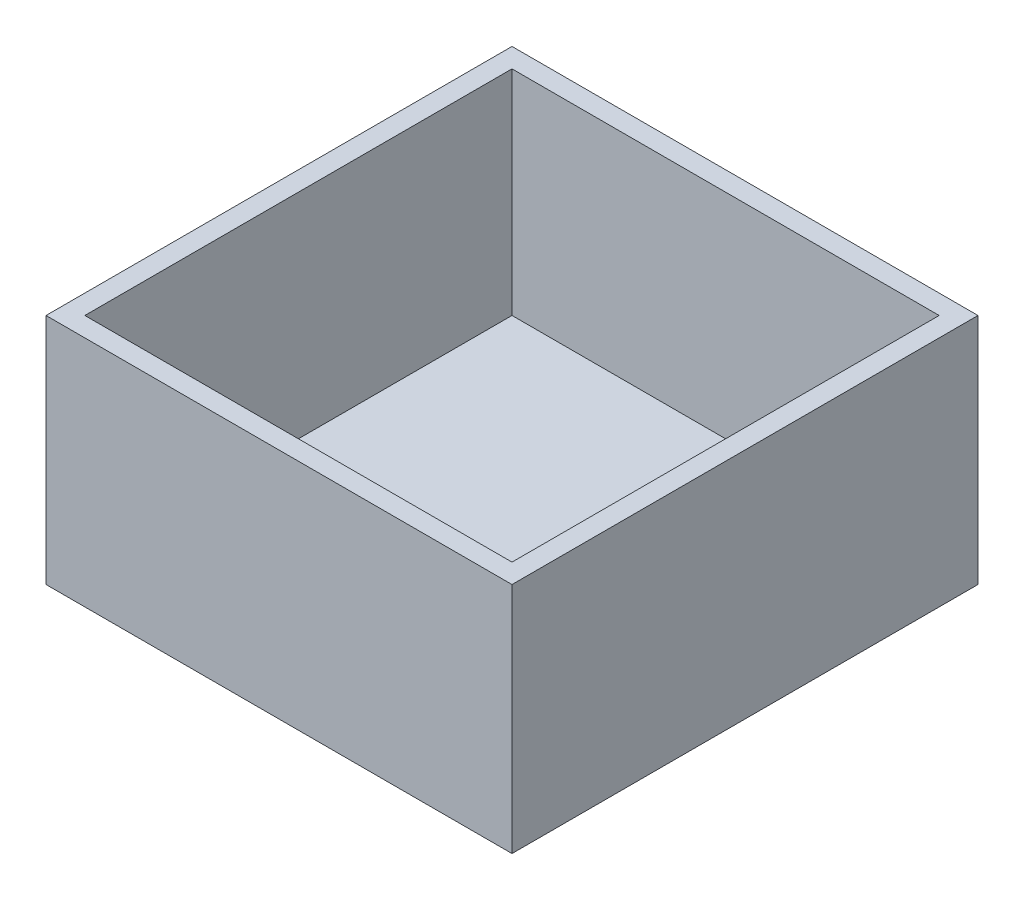
ISO-10303-21;
HEADER;
FILE_DESCRIPTION(('STEP AP214'),'2;1');
FILE_NAME('part.step','',(''),(''),'','','');
FILE_SCHEMA(('AUTOMOTIVE_DESIGN { 1 0 10303 214 1 1 1 1 }'));
ENDSEC;
DATA;
#1=APPLICATION_CONTEXT('core data for automotive mechanical design processes');
#2=APPLICATION_PROTOCOL_DEFINITION('international standard','automotive_design',2000,#1);
#3=PRODUCT_CONTEXT('',#1,'mechanical');
#4=PRODUCT('Part','Part','',(#3));
#5=PRODUCT_RELATED_PRODUCT_CATEGORY('part','',(#4));
#6=PRODUCT_DEFINITION_FORMATION('','',#4);
#7=PRODUCT_DEFINITION_CONTEXT('part definition',#1,'design');
#8=PRODUCT_DEFINITION('design','',#6,#7);
#9=PRODUCT_DEFINITION_SHAPE('','',#8);
#10=(LENGTH_UNIT() NAMED_UNIT(*) SI_UNIT(.MILLI.,.METRE.));
#11=(NAMED_UNIT(*) PLANE_ANGLE_UNIT() SI_UNIT($,.RADIAN.));
#12=(NAMED_UNIT(*) SI_UNIT($,.STERADIAN.) SOLID_ANGLE_UNIT());
#13=UNCERTAINTY_MEASURE_WITH_UNIT(LENGTH_MEASURE(1.E-05),#10,'distance_accuracy_value','');
#14=(GEOMETRIC_REPRESENTATION_CONTEXT(3) GLOBAL_UNCERTAINTY_ASSIGNED_CONTEXT((#13)) GLOBAL_UNIT_ASSIGNED_CONTEXT((#10,
#11,#12)) REPRESENTATION_CONTEXT('',''));
#15=CARTESIAN_POINT('',(0.,0.,0.));
#16=DIRECTION('',(0.,0.,1.));
#17=DIRECTION('',(1.,0.,0.));
#18=AXIS2_PLACEMENT_3D('',#15,#16,#17);
#19=CARTESIAN_POINT('',(60.,5.,60.));
#20=DIRECTION('',(-1.,0.,0.));
#21=DIRECTION('',(0.,0.,1.));
#22=AXIS2_PLACEMENT_3D('',#19,#20,#21);
#23=PLANE('',#22);
#24=DIRECTION('',(0.,0.,-1.));
#25=VECTOR('',#24,1.);
#26=CARTESIAN_POINT('',(60.,0.,60.));
#27=LINE('',#26,#25);
#28=CARTESIAN_POINT('',(60.,0.,60.));
#29=VERTEX_POINT('',#28);
#30=CARTESIAN_POINT('',(60.,0.,-60.));
#31=VERTEX_POINT('',#30);
#32=EDGE_CURVE('E154',#29,#31,#27,.T.);
#33=ORIENTED_EDGE('',*,*,#32,.T.);
#34=DIRECTION('',(0.,-1.,0.));
#35=VECTOR('',#34,1.);
#36=CARTESIAN_POINT('',(60.,5.,-60.));
#37=LINE('',#36,#35);
#38=CARTESIAN_POINT('',(60.,60.,-60.));
#39=VERTEX_POINT('',#38);
#40=EDGE_CURVE('E11',#39,#31,#37,.T.);
#41=ORIENTED_EDGE('',*,*,#40,.F.);
#42=DIRECTION('',(0.,0.,-1.));
#43=VECTOR('',#42,1.);
#44=CARTESIAN_POINT('',(60.,60.,60.));
#45=LINE('',#44,#43);
#46=CARTESIAN_POINT('',(60.,60.,60.));
#47=VERTEX_POINT('',#46);
#48=EDGE_CURVE('E119',#47,#39,#45,.T.);
#49=ORIENTED_EDGE('',*,*,#48,.F.);
#50=DIRECTION('',(0.,-1.,0.));
#51=VECTOR('',#50,1.);
#52=CARTESIAN_POINT('',(60.,5.,60.));
#53=LINE('',#52,#51);
#54=EDGE_CURVE('E162',#47,#29,#53,.T.);
#55=ORIENTED_EDGE('',*,*,#54,.T.);
#56=EDGE_LOOP('',(#33,#41,#49,#55));
#57=FACE_BOUND('',#56,.T.);
#58=ADVANCED_FACE('F37',(#57),#23,.F.);
#59=CARTESIAN_POINT('',(-60.,5.,-60.));
#60=DIRECTION('',(0.,0.,1.));
#61=DIRECTION('',(1.,0.,0.));
#62=AXIS2_PLACEMENT_3D('',#59,#60,#61);
#63=PLANE('',#62);
#64=DIRECTION('',(-1.,0.,0.));
#65=VECTOR('',#64,1.);
#66=CARTESIAN_POINT('',(-60.,0.,-60.));
#67=LINE('',#66,#65);
#68=CARTESIAN_POINT('',(-60.,0.,-60.));
#69=VERTEX_POINT('',#68);
#70=EDGE_CURVE('E157',#31,#69,#67,.T.);
#71=ORIENTED_EDGE('',*,*,#70,.T.);
#72=DIRECTION('',(0.,-1.,0.));
#73=VECTOR('',#72,1.);
#74=CARTESIAN_POINT('',(-60.,5.,-60.));
#75=LINE('',#74,#73);
#76=CARTESIAN_POINT('',(-60.,60.,-60.));
#77=VERTEX_POINT('',#76);
#78=EDGE_CURVE('E44',#77,#69,#75,.T.);
#79=ORIENTED_EDGE('',*,*,#78,.F.);
#80=DIRECTION('',(-1.,0.,0.));
#81=VECTOR('',#80,1.);
#82=CARTESIAN_POINT('',(-60.,60.,-60.));
#83=LINE('',#82,#81);
#84=EDGE_CURVE('E145',#39,#77,#83,.T.);
#85=ORIENTED_EDGE('',*,*,#84,.F.);
#86=ORIENTED_EDGE('',*,*,#40,.T.);
#87=EDGE_LOOP('',(#71,#79,#85,#86));
#88=FACE_BOUND('',#87,.T.);
#89=ADVANCED_FACE('F180',(#88),#63,.F.);
#90=CARTESIAN_POINT('',(-60.,5.,60.));
#91=DIRECTION('',(1.,0.,0.));
#92=DIRECTION('',(0.,0.,-1.));
#93=AXIS2_PLACEMENT_3D('',#90,#91,#92);
#94=PLANE('',#93);
#95=DIRECTION('',(0.,0.,1.));
#96=VECTOR('',#95,1.);
#97=CARTESIAN_POINT('',(-60.,0.,60.));
#98=LINE('',#97,#96);
#99=CARTESIAN_POINT('',(-60.,0.,60.));
#100=VERTEX_POINT('',#99);
#101=EDGE_CURVE('E159',#69,#100,#98,.T.);
#102=ORIENTED_EDGE('',*,*,#101,.T.);
#103=DIRECTION('',(0.,-1.,0.));
#104=VECTOR('',#103,1.);
#105=CARTESIAN_POINT('',(-60.,5.,60.));
#106=LINE('',#105,#104);
#107=CARTESIAN_POINT('',(-60.,60.,60.));
#108=VERTEX_POINT('',#107);
#109=EDGE_CURVE('E164',#108,#100,#106,.T.);
#110=ORIENTED_EDGE('',*,*,#109,.F.);
#111=DIRECTION('',(0.,0.,1.));
#112=VECTOR('',#111,1.);
#113=CARTESIAN_POINT('',(-60.,60.,60.));
#114=LINE('',#113,#112);
#115=EDGE_CURVE('E148',#77,#108,#114,.T.);
#116=ORIENTED_EDGE('',*,*,#115,.F.);
#117=ORIENTED_EDGE('',*,*,#78,.T.);
#118=EDGE_LOOP('',(#102,#110,#116,#117));
#119=FACE_BOUND('',#118,.T.);
#120=ADVANCED_FACE('F169',(#119),#94,.F.);
#121=CARTESIAN_POINT('',(-60.,5.,60.));
#122=DIRECTION('',(0.,0.,-1.));
#123=DIRECTION('',(-1.,0.,0.));
#124=AXIS2_PLACEMENT_3D('',#121,#122,#123);
#125=PLANE('',#124);
#126=DIRECTION('',(1.,0.,0.));
#127=VECTOR('',#126,1.);
#128=CARTESIAN_POINT('',(-60.,0.,60.));
#129=LINE('',#128,#127);
#130=EDGE_CURVE('E59',#100,#29,#129,.T.);
#131=ORIENTED_EDGE('',*,*,#130,.T.);
#132=ORIENTED_EDGE('',*,*,#54,.F.);
#133=DIRECTION('',(1.,0.,0.));
#134=VECTOR('',#133,1.);
#135=CARTESIAN_POINT('',(-60.,60.,60.));
#136=LINE('',#135,#134);
#137=EDGE_CURVE('E151',#108,#47,#136,.T.);
#138=ORIENTED_EDGE('',*,*,#137,.F.);
#139=ORIENTED_EDGE('',*,*,#109,.T.);
#140=EDGE_LOOP('',(#131,#132,#138,#139));
#141=FACE_BOUND('',#140,.T.);
#142=ADVANCED_FACE('F178',(#141),#125,.F.);
#143=CARTESIAN_POINT('',(0.,0.,0.));
#144=DIRECTION('',(0.,-1.,0.));
#145=DIRECTION('',(0.,0.,-1.));
#146=AXIS2_PLACEMENT_3D('',#143,#144,#145);
#147=PLANE('',#146);
#148=ORIENTED_EDGE('',*,*,#32,.F.);
#149=ORIENTED_EDGE('',*,*,#130,.F.);
#150=ORIENTED_EDGE('',*,*,#101,.F.);
#151=ORIENTED_EDGE('',*,*,#70,.F.);
#152=EDGE_LOOP('',(#148,#149,#150,#151));
#153=FACE_BOUND('',#152,.T.);
#154=ADVANCED_FACE('F174',(#153),#147,.T.);
#155=CARTESIAN_POINT('',(0.,60.,0.));
#156=DIRECTION('',(0.,-1.,0.));
#157=DIRECTION('',(0.,0.,-1.));
#158=AXIS2_PLACEMENT_3D('',#155,#156,#157);
#159=PLANE('',#158);
#160=ORIENTED_EDGE('',*,*,#48,.T.);
#161=ORIENTED_EDGE('',*,*,#84,.T.);
#162=ORIENTED_EDGE('',*,*,#115,.T.);
#163=ORIENTED_EDGE('',*,*,#137,.T.);
#164=EDGE_LOOP('',(#160,#161,#162,#163));
#165=FACE_BOUND('',#164,.T.);
#166=DIRECTION('',(0.,0.,-1.));
#167=VECTOR('',#166,1.);
#168=CARTESIAN_POINT('',(55.,60.,55.));
#169=LINE('',#168,#167);
#170=CARTESIAN_POINT('',(55.,60.,55.));
#171=VERTEX_POINT('',#170);
#172=CARTESIAN_POINT('',(55.,60.,-55.));
#173=VERTEX_POINT('',#172);
#174=EDGE_CURVE('E103',#171,#173,#169,.T.);
#175=ORIENTED_EDGE('',*,*,#174,.F.);
#176=DIRECTION('',(1.,0.,0.));
#177=VECTOR('',#176,1.);
#178=CARTESIAN_POINT('',(-55.,60.,55.));
#179=LINE('',#178,#177);
#180=CARTESIAN_POINT('',(-55.,60.,55.));
#181=VERTEX_POINT('',#180);
#182=EDGE_CURVE('E127',#181,#171,#179,.T.);
#183=ORIENTED_EDGE('',*,*,#182,.F.);
#184=DIRECTION('',(0.,0.,1.));
#185=VECTOR('',#184,1.);
#186=CARTESIAN_POINT('',(-55.,60.,55.));
#187=LINE('',#186,#185);
#188=CARTESIAN_POINT('',(-55.,60.,-55.));
#189=VERTEX_POINT('',#188);
#190=EDGE_CURVE('E125',#189,#181,#187,.T.);
#191=ORIENTED_EDGE('',*,*,#190,.F.);
#192=DIRECTION('',(-1.,0.,0.));
#193=VECTOR('',#192,1.);
#194=CARTESIAN_POINT('',(-55.,60.,-55.));
#195=LINE('',#194,#193);
#196=EDGE_CURVE('E111',#173,#189,#195,.T.);
#197=ORIENTED_EDGE('',*,*,#196,.F.);
#198=EDGE_LOOP('',(#175,#183,#191,#197));
#199=FACE_BOUND('',#198,.T.);
#200=ADVANCED_FACE('F123',(#165,#199),#159,.F.);
#201=CARTESIAN_POINT('',(55.,60.,55.));
#202=DIRECTION('',(-1.,0.,0.));
#203=DIRECTION('',(0.,0.,1.));
#204=AXIS2_PLACEMENT_3D('',#201,#202,#203);
#205=PLANE('',#204);
#206=DIRECTION('',(0.,0.,-1.));
#207=VECTOR('',#206,1.);
#208=CARTESIAN_POINT('',(55.,5.,55.));
#209=LINE('',#208,#207);
#210=CARTESIAN_POINT('',(55.,5.,55.));
#211=VERTEX_POINT('',#210);
#212=CARTESIAN_POINT('',(55.,5.,-55.));
#213=VERTEX_POINT('',#212);
#214=EDGE_CURVE('E131',#211,#213,#209,.T.);
#215=ORIENTED_EDGE('',*,*,#214,.F.);
#216=DIRECTION('',(0.,-1.,0.));
#217=VECTOR('',#216,1.);
#218=CARTESIAN_POINT('',(55.,60.,55.));
#219=LINE('',#218,#217);
#220=EDGE_CURVE('E51',#171,#211,#219,.T.);
#221=ORIENTED_EDGE('',*,*,#220,.F.);
#222=ORIENTED_EDGE('',*,*,#174,.T.);
#223=DIRECTION('',(0.,-1.,0.));
#224=VECTOR('',#223,1.);
#225=CARTESIAN_POINT('',(55.,60.,-55.));
#226=LINE('',#225,#224);
#227=EDGE_CURVE('E106',#173,#213,#226,.T.);
#228=ORIENTED_EDGE('',*,*,#227,.T.);
#229=EDGE_LOOP('',(#215,#221,#222,#228));
#230=FACE_BOUND('',#229,.T.);
#231=ADVANCED_FACE('F105',(#230),#205,.T.);
#232=CARTESIAN_POINT('',(-55.,60.,-55.));
#233=DIRECTION('',(0.,0.,1.));
#234=DIRECTION('',(1.,0.,0.));
#235=AXIS2_PLACEMENT_3D('',#232,#233,#234);
#236=PLANE('',#235);
#237=DIRECTION('',(-1.,0.,0.));
#238=VECTOR('',#237,1.);
#239=CARTESIAN_POINT('',(-55.,5.,-55.));
#240=LINE('',#239,#238);
#241=CARTESIAN_POINT('',(-55.,5.,-55.));
#242=VERTEX_POINT('',#241);
#243=EDGE_CURVE('E118',#213,#242,#240,.T.);
#244=ORIENTED_EDGE('',*,*,#243,.F.);
#245=ORIENTED_EDGE('',*,*,#227,.F.);
#246=ORIENTED_EDGE('',*,*,#196,.T.);
#247=DIRECTION('',(0.,-1.,0.));
#248=VECTOR('',#247,1.);
#249=CARTESIAN_POINT('',(-55.,60.,-55.));
#250=LINE('',#249,#248);
#251=EDGE_CURVE('E120',#189,#242,#250,.T.);
#252=ORIENTED_EDGE('',*,*,#251,.T.);
#253=EDGE_LOOP('',(#244,#245,#246,#252));
#254=FACE_BOUND('',#253,.T.);
#255=ADVANCED_FACE('F115',(#254),#236,.T.);
#256=CARTESIAN_POINT('',(-55.,60.,55.));
#257=DIRECTION('',(1.,0.,0.));
#258=DIRECTION('',(0.,0.,-1.));
#259=AXIS2_PLACEMENT_3D('',#256,#257,#258);
#260=PLANE('',#259);
#261=DIRECTION('',(0.,0.,1.));
#262=VECTOR('',#261,1.);
#263=CARTESIAN_POINT('',(-55.,5.,55.));
#264=LINE('',#263,#262);
#265=CARTESIAN_POINT('',(-55.,5.,55.));
#266=VERTEX_POINT('',#265);
#267=EDGE_CURVE('E134',#242,#266,#264,.T.);
#268=ORIENTED_EDGE('',*,*,#267,.F.);
#269=ORIENTED_EDGE('',*,*,#251,.F.);
#270=ORIENTED_EDGE('',*,*,#190,.T.);
#271=DIRECTION('',(0.,-1.,0.));
#272=VECTOR('',#271,1.);
#273=CARTESIAN_POINT('',(-55.,60.,55.));
#274=LINE('',#273,#272);
#275=EDGE_CURVE('E140',#181,#266,#274,.T.);
#276=ORIENTED_EDGE('',*,*,#275,.T.);
#277=EDGE_LOOP('',(#268,#269,#270,#276));
#278=FACE_BOUND('',#277,.T.);
#279=ADVANCED_FACE('F203',(#278),#260,.T.);
#280=CARTESIAN_POINT('',(-55.,60.,55.));
#281=DIRECTION('',(0.,0.,-1.));
#282=DIRECTION('',(-1.,0.,0.));
#283=AXIS2_PLACEMENT_3D('',#280,#281,#282);
#284=PLANE('',#283);
#285=DIRECTION('',(1.,0.,0.));
#286=VECTOR('',#285,1.);
#287=CARTESIAN_POINT('',(-55.,5.,55.));
#288=LINE('',#287,#286);
#289=EDGE_CURVE('E112',#266,#211,#288,.T.);
#290=ORIENTED_EDGE('',*,*,#289,.F.);
#291=ORIENTED_EDGE('',*,*,#275,.F.);
#292=ORIENTED_EDGE('',*,*,#182,.T.);
#293=ORIENTED_EDGE('',*,*,#220,.T.);
#294=EDGE_LOOP('',(#290,#291,#292,#293));
#295=FACE_BOUND('',#294,.T.);
#296=ADVANCED_FACE('F195',(#295),#284,.T.);
#297=CARTESIAN_POINT('',(0.,5.,0.));
#298=DIRECTION('',(0.,-1.,0.));
#299=DIRECTION('',(0.,0.,-1.));
#300=AXIS2_PLACEMENT_3D('',#297,#298,#299);
#301=PLANE('',#300);
#302=ORIENTED_EDGE('',*,*,#289,.T.);
#303=ORIENTED_EDGE('',*,*,#214,.T.);
#304=ORIENTED_EDGE('',*,*,#243,.T.);
#305=ORIENTED_EDGE('',*,*,#267,.T.);
#306=EDGE_LOOP('',(#302,#303,#304,#305));
#307=FACE_BOUND('',#306,.T.);
#308=ADVANCED_FACE('F192',(#307),#301,.F.);
#309=CLOSED_SHELL('',(#58,#89,#120,#142,#154,#200,#231,#255,#279,#296,#308));
#310=MANIFOLD_SOLID_BREP('B2',#309);
#311=ADVANCED_BREP_SHAPE_REPRESENTATION('',(#18,#310),#14);
#312=SHAPE_DEFINITION_REPRESENTATION(#9,#311);
ENDSEC;
END-ISO-10303-21;
